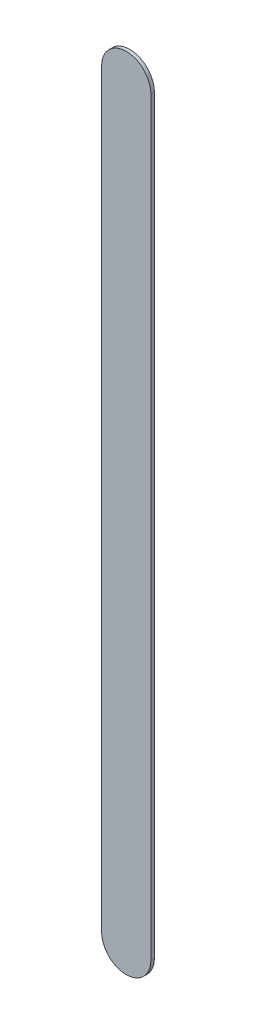
ISO-10303-21;
HEADER;
FILE_DESCRIPTION(('STEP AP214'),'2;1');
FILE_NAME('part.step','',(''),(''),'','','');
FILE_SCHEMA(('AUTOMOTIVE_DESIGN { 1 0 10303 214 1 1 1 1 }'));
ENDSEC;
DATA;
#1=APPLICATION_CONTEXT('core data for automotive mechanical design processes');
#2=APPLICATION_PROTOCOL_DEFINITION('international standard','automotive_design',2000,#1);
#3=PRODUCT_CONTEXT('',#1,'mechanical');
#4=PRODUCT('Part','Part','',(#3));
#5=PRODUCT_RELATED_PRODUCT_CATEGORY('part','',(#4));
#6=PRODUCT_DEFINITION_FORMATION('','',#4);
#7=PRODUCT_DEFINITION_CONTEXT('part definition',#1,'design');
#8=PRODUCT_DEFINITION('design','',#6,#7);
#9=PRODUCT_DEFINITION_SHAPE('','',#8);
#10=(LENGTH_UNIT() NAMED_UNIT(*) SI_UNIT(.MILLI.,.METRE.));
#11=(NAMED_UNIT(*) PLANE_ANGLE_UNIT() SI_UNIT($,.RADIAN.));
#12=(NAMED_UNIT(*) SI_UNIT($,.STERADIAN.) SOLID_ANGLE_UNIT());
#13=UNCERTAINTY_MEASURE_WITH_UNIT(LENGTH_MEASURE(1.E-05),#10,'distance_accuracy_value','');
#14=(GEOMETRIC_REPRESENTATION_CONTEXT(3) GLOBAL_UNCERTAINTY_ASSIGNED_CONTEXT((#13)) GLOBAL_UNIT_ASSIGNED_CONTEXT((#10,
#11,#12)) REPRESENTATION_CONTEXT('',''));
#15=CARTESIAN_POINT('',(0.,0.,0.));
#16=DIRECTION('',(0.,0.,1.));
#17=DIRECTION('',(1.,0.,0.));
#18=AXIS2_PLACEMENT_3D('',#15,#16,#17);
#19=CARTESIAN_POINT('',(37.89171238,94.62171322,0.));
#20=DIRECTION('',(-1.,0.,0.));
#21=DIRECTION('',(0.,1.,0.));
#22=AXIS2_PLACEMENT_3D('',#19,#20,#21);
#23=PLANE('',#22);
#24=DIRECTION('',(0.,1.,0.));
#25=VECTOR('',#24,1.);
#26=CARTESIAN_POINT('',(37.89171238,94.62171322,0.03556));
#27=LINE('',#26,#25);
#28=CARTESIAN_POINT('',(37.89171238,94.62171322,0.03556));
#29=VERTEX_POINT('',#28);
#30=CARTESIAN_POINT('',(37.89171238,102.24171068,0.03556));
#31=VERTEX_POINT('',#30);
#32=EDGE_CURVE('E11',#29,#31,#27,.T.);
#33=ORIENTED_EDGE('',*,*,#32,.F.);
#34=DIRECTION('',(0.,0.,1.));
#35=VECTOR('',#34,1.);
#36=CARTESIAN_POINT('',(37.89171238,94.62171322,0.));
#37=LINE('',#36,#35);
#38=CARTESIAN_POINT('',(37.89171238,94.62171322,0.));
#39=VERTEX_POINT('',#38);
#40=EDGE_CURVE('E24',#39,#29,#37,.T.);
#41=ORIENTED_EDGE('',*,*,#40,.F.);
#42=DIRECTION('',(0.,1.,0.));
#43=VECTOR('',#42,1.);
#44=CARTESIAN_POINT('',(37.89171238,94.62171322,0.));
#45=LINE('',#44,#43);
#46=CARTESIAN_POINT('',(37.89171238,102.24171068,0.));
#47=VERTEX_POINT('',#46);
#48=EDGE_CURVE('E75',#39,#47,#45,.T.);
#49=ORIENTED_EDGE('',*,*,#48,.T.);
#50=DIRECTION('',(0.,0.,1.));
#51=VECTOR('',#50,1.);
#52=CARTESIAN_POINT('',(37.89171238,102.24171068,0.));
#53=LINE('',#52,#51);
#54=EDGE_CURVE('E37',#47,#31,#53,.T.);
#55=ORIENTED_EDGE('',*,*,#54,.T.);
#56=EDGE_LOOP('',(#33,#41,#49,#55));
#57=FACE_BOUND('',#56,.T.);
#58=ADVANCED_FACE('F17',(#57),#23,.F.);
#59=CARTESIAN_POINT('',(37.64171288,102.24171068,0.));
#60=DIRECTION('',(0.,0.,-1.));
#61=DIRECTION('',(1.,0.,0.));
#62=AXIS2_PLACEMENT_3D('',#59,#60,#61);
#63=CYLINDRICAL_SURFACE('',#62,0.249999500000001);
#64=CARTESIAN_POINT('',(37.64171288,102.24171068,0.03556));
#65=DIRECTION('',(0.,0.,1.));
#66=DIRECTION('',(1.,0.,0.));
#67=AXIS2_PLACEMENT_3D('',#64,#65,#66);
#68=CIRCLE('',#67,0.249999500000001);
#69=CARTESIAN_POINT('',(37.39171338,102.24171068,0.03556));
#70=VERTEX_POINT('',#69);
#71=EDGE_CURVE('E83',#31,#70,#68,.T.);
#72=ORIENTED_EDGE('',*,*,#71,.F.);
#73=ORIENTED_EDGE('',*,*,#54,.F.);
#74=CARTESIAN_POINT('',(37.64171288,102.24171068,0.));
#75=DIRECTION('',(0.,0.,1.));
#76=DIRECTION('',(1.,0.,0.));
#77=AXIS2_PLACEMENT_3D('',#74,#75,#76);
#78=CIRCLE('',#77,0.249999500000001);
#79=CARTESIAN_POINT('',(37.39171338,102.24171068,0.));
#80=VERTEX_POINT('',#79);
#81=EDGE_CURVE('E81',#47,#80,#78,.T.);
#82=ORIENTED_EDGE('',*,*,#81,.T.);
#83=DIRECTION('',(0.,0.,1.));
#84=VECTOR('',#83,1.);
#85=CARTESIAN_POINT('',(37.39171338,102.24171068,0.));
#86=LINE('',#85,#84);
#87=EDGE_CURVE('E67',#80,#70,#86,.T.);
#88=ORIENTED_EDGE('',*,*,#87,.T.);
#89=EDGE_LOOP('',(#72,#73,#82,#88));
#90=FACE_BOUND('',#89,.T.);
#91=ADVANCED_FACE('F89',(#90),#63,.T.);
#92=CARTESIAN_POINT('',(37.39171338,102.24171068,0.));
#93=DIRECTION('',(1.,0.,0.));
#94=DIRECTION('',(0.,-1.,0.));
#95=AXIS2_PLACEMENT_3D('',#92,#93,#94);
#96=PLANE('',#95);
#97=DIRECTION('',(0.,-1.,0.));
#98=VECTOR('',#97,1.);
#99=CARTESIAN_POINT('',(37.39171338,102.24171068,0.03556));
#100=LINE('',#99,#98);
#101=CARTESIAN_POINT('',(37.39171338,94.62171322,0.03556));
#102=VERTEX_POINT('',#101);
#103=EDGE_CURVE('E71',#70,#102,#100,.T.);
#104=ORIENTED_EDGE('',*,*,#103,.F.);
#105=ORIENTED_EDGE('',*,*,#87,.F.);
#106=DIRECTION('',(0.,-1.,0.));
#107=VECTOR('',#106,1.);
#108=CARTESIAN_POINT('',(37.39171338,102.24171068,0.));
#109=LINE('',#108,#107);
#110=CARTESIAN_POINT('',(37.39171338,94.62171322,0.));
#111=VERTEX_POINT('',#110);
#112=EDGE_CURVE('E63',#80,#111,#109,.T.);
#113=ORIENTED_EDGE('',*,*,#112,.T.);
#114=DIRECTION('',(0.,0.,1.));
#115=VECTOR('',#114,1.);
#116=CARTESIAN_POINT('',(37.39171338,94.62171322,0.));
#117=LINE('',#116,#115);
#118=EDGE_CURVE('E53',#111,#102,#117,.T.);
#119=ORIENTED_EDGE('',*,*,#118,.T.);
#120=EDGE_LOOP('',(#104,#105,#113,#119));
#121=FACE_BOUND('',#120,.T.);
#122=ADVANCED_FACE('F66',(#121),#96,.F.);
#123=CARTESIAN_POINT('',(37.64171288,94.62171322,0.));
#124=DIRECTION('',(0.,0.,-1.));
#125=DIRECTION('',(-1.,0.,0.));
#126=AXIS2_PLACEMENT_3D('',#123,#124,#125);
#127=CYLINDRICAL_SURFACE('',#126,0.249999500000001);
#128=CARTESIAN_POINT('',(37.64171288,94.62171322,0.03556));
#129=DIRECTION('',(0.,0.,1.));
#130=DIRECTION('',(-1.,0.,0.));
#131=AXIS2_PLACEMENT_3D('',#128,#129,#130);
#132=CIRCLE('',#131,0.249999500000001);
#133=EDGE_CURVE('E59',#102,#29,#132,.T.);
#134=ORIENTED_EDGE('',*,*,#133,.F.);
#135=ORIENTED_EDGE('',*,*,#118,.F.);
#136=CARTESIAN_POINT('',(37.64171288,94.62171322,0.));
#137=DIRECTION('',(0.,0.,1.));
#138=DIRECTION('',(-1.,0.,0.));
#139=AXIS2_PLACEMENT_3D('',#136,#137,#138);
#140=CIRCLE('',#139,0.249999500000001);
#141=EDGE_CURVE('E57',#111,#39,#140,.T.);
#142=ORIENTED_EDGE('',*,*,#141,.T.);
#143=ORIENTED_EDGE('',*,*,#40,.T.);
#144=EDGE_LOOP('',(#134,#135,#142,#143));
#145=FACE_BOUND('',#144,.T.);
#146=ADVANCED_FACE('F55',(#145),#127,.T.);
#147=CARTESIAN_POINT('',(37.89171238,94.62171322,0.));
#148=DIRECTION('',(0.,0.,-1.));
#149=DIRECTION('',(-1.,0.,0.));
#150=AXIS2_PLACEMENT_3D('',#147,#148,#149);
#151=PLANE('',#150);
#152=ORIENTED_EDGE('',*,*,#141,.F.);
#153=ORIENTED_EDGE('',*,*,#112,.F.);
#154=ORIENTED_EDGE('',*,*,#81,.F.);
#155=ORIENTED_EDGE('',*,*,#48,.F.);
#156=EDGE_LOOP('',(#152,#153,#154,#155));
#157=FACE_BOUND('',#156,.T.);
#158=ADVANCED_FACE('F74',(#157),#151,.T.);
#159=CARTESIAN_POINT('',(37.89171238,94.62171322,0.03556));
#160=DIRECTION('',(0.,0.,-1.));
#161=DIRECTION('',(-1.,0.,0.));
#162=AXIS2_PLACEMENT_3D('',#159,#160,#161);
#163=PLANE('',#162);
#164=ORIENTED_EDGE('',*,*,#32,.T.);
#165=ORIENTED_EDGE('',*,*,#71,.T.);
#166=ORIENTED_EDGE('',*,*,#103,.T.);
#167=ORIENTED_EDGE('',*,*,#133,.T.);
#168=EDGE_LOOP('',(#164,#165,#166,#167));
#169=FACE_BOUND('',#168,.T.);
#170=ADVANCED_FACE('F91',(#169),#163,.F.);
#171=CLOSED_SHELL('',(#58,#91,#122,#146,#158,#170));
#172=MANIFOLD_SOLID_BREP('B1',#171);
#173=ADVANCED_BREP_SHAPE_REPRESENTATION('',(#18,#172),#14);
#174=SHAPE_DEFINITION_REPRESENTATION(#9,#173);
ENDSEC;
END-ISO-10303-21;
